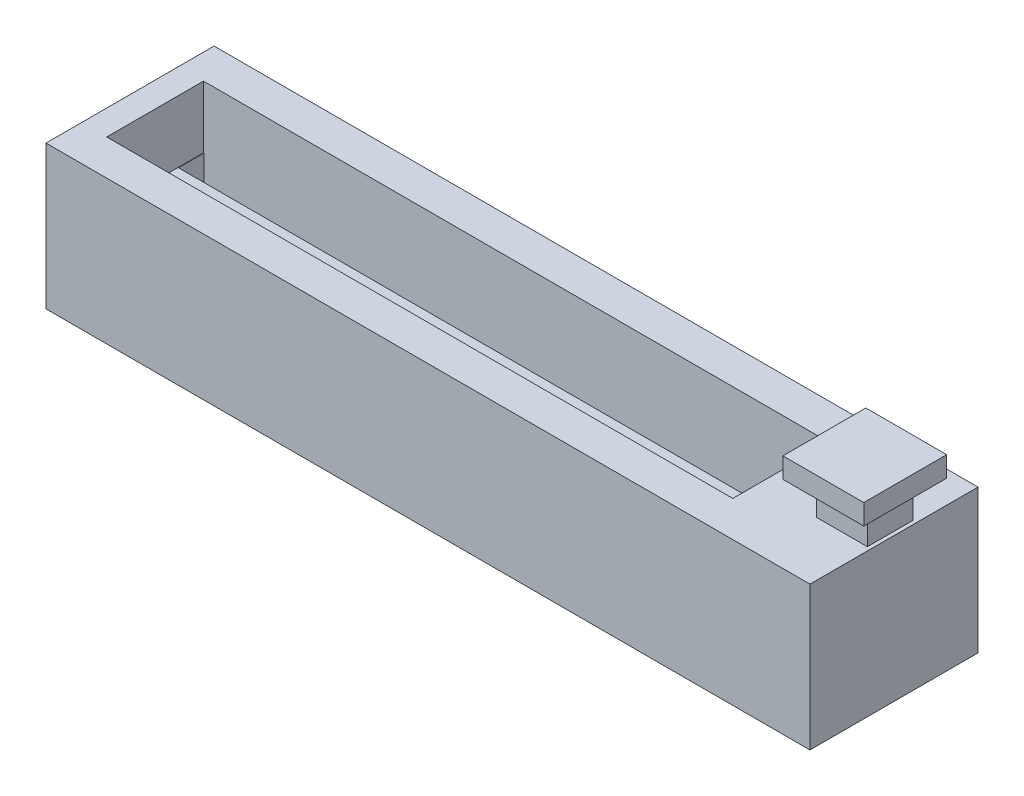
ISO-10303-21;
HEADER;
FILE_DESCRIPTION(('STEP AP214'),'2;1');
FILE_NAME('part.step','',(''),(''),'','','');
FILE_SCHEMA(('AUTOMOTIVE_DESIGN { 1 0 10303 214 1 1 1 1 }'));
ENDSEC;
DATA;
#1=APPLICATION_CONTEXT('core data for automotive mechanical design processes');
#2=APPLICATION_PROTOCOL_DEFINITION('international standard','automotive_design',2000,#1);
#3=PRODUCT_CONTEXT('',#1,'mechanical');
#4=PRODUCT('Part','Part','',(#3));
#5=PRODUCT_RELATED_PRODUCT_CATEGORY('part','',(#4));
#6=PRODUCT_DEFINITION_FORMATION('','',#4);
#7=PRODUCT_DEFINITION_CONTEXT('part definition',#1,'design');
#8=PRODUCT_DEFINITION('design','',#6,#7);
#9=PRODUCT_DEFINITION_SHAPE('','',#8);
#10=(LENGTH_UNIT() NAMED_UNIT(*) SI_UNIT(.MILLI.,.METRE.));
#11=(NAMED_UNIT(*) PLANE_ANGLE_UNIT() SI_UNIT($,.RADIAN.));
#12=(NAMED_UNIT(*) SI_UNIT($,.STERADIAN.) SOLID_ANGLE_UNIT());
#13=UNCERTAINTY_MEASURE_WITH_UNIT(LENGTH_MEASURE(1.E-05),#10,'distance_accuracy_value','');
#14=(GEOMETRIC_REPRESENTATION_CONTEXT(3) GLOBAL_UNCERTAINTY_ASSIGNED_CONTEXT((#13)) GLOBAL_UNIT_ASSIGNED_CONTEXT((#10,
#11,#12)) REPRESENTATION_CONTEXT('',''));
#15=CARTESIAN_POINT('',(0.,0.,0.));
#16=DIRECTION('',(0.,0.,1.));
#17=DIRECTION('',(1.,0.,0.));
#18=AXIS2_PLACEMENT_3D('',#15,#16,#17);
#19=CARTESIAN_POINT('',(0.,13.,3.5));
#20=DIRECTION('',(0.,0.,1.));
#21=DIRECTION('',(1.,0.,0.));
#22=AXIS2_PLACEMENT_3D('',#19,#20,#21);
#23=PLANE('',#22);
#24=DIRECTION('',(0.,-1.,0.));
#25=VECTOR('',#24,1.);
#26=CARTESIAN_POINT('',(0.,13.,3.5));
#27=LINE('',#26,#25);
#28=CARTESIAN_POINT('',(0.,9.03551671751368,3.5));
#29=VERTEX_POINT('',#28);
#30=CARTESIAN_POINT('',(0.,5.,3.5));
#31=VERTEX_POINT('',#30);
#32=EDGE_CURVE('E1055',#29,#31,#27,.T.);
#33=ORIENTED_EDGE('',*,*,#32,.T.);
#34=DIRECTION('',(1.,0.,0.));
#35=VECTOR('',#34,1.);
#36=CARTESIAN_POINT('',(0.,5.,3.5));
#37=LINE('',#36,#35);
#38=CARTESIAN_POINT('',(64.,5.,3.5));
#39=VERTEX_POINT('',#38);
#40=EDGE_CURVE('E1323',#31,#39,#37,.T.);
#41=ORIENTED_EDGE('',*,*,#40,.T.);
#42=DIRECTION('',(0.,1.,0.));
#43=VECTOR('',#42,1.);
#44=CARTESIAN_POINT('',(64.,0.,3.5));
#45=LINE('',#44,#43);
#46=CARTESIAN_POINT('',(64.,13.,3.5));
#47=VERTEX_POINT('',#46);
#48=EDGE_CURVE('E1073',#39,#47,#45,.T.);
#49=ORIENTED_EDGE('',*,*,#48,.T.);
#50=DIRECTION('',(1.,0.,0.));
#51=VECTOR('',#50,1.);
#52=CARTESIAN_POINT('',(0.,13.,3.5));
#53=LINE('',#52,#51);
#54=CARTESIAN_POINT('',(63.9293439173562,13.,3.5));
#55=VERTEX_POINT('',#54);
#56=EDGE_CURVE('E1042',#55,#47,#53,.T.);
#57=ORIENTED_EDGE('',*,*,#56,.F.);
#58=DIRECTION('',(0.,-1.,0.));
#59=VECTOR('',#58,1.);
#60=CARTESIAN_POINT('',(63.9293439173562,19.1,3.5));
#61=LINE('',#60,#59);
#62=CARTESIAN_POINT('',(63.9293439173562,19.1,3.5));
#63=VERTEX_POINT('',#62);
#64=EDGE_CURVE('E1170',#63,#55,#61,.T.);
#65=ORIENTED_EDGE('',*,*,#64,.F.);
#66=DIRECTION('',(1.,0.,0.));
#67=VECTOR('',#66,1.);
#68=CARTESIAN_POINT('',(2.46362599225041,19.1,3.5));
#69=LINE('',#68,#67);
#70=CARTESIAN_POINT('',(2.46362599225041,19.1,3.5));
#71=VERTEX_POINT('',#70);
#72=EDGE_CURVE('E1054',#71,#63,#69,.T.);
#73=ORIENTED_EDGE('',*,*,#72,.F.);
#74=DIRECTION('',(0.,-1.,0.));
#75=VECTOR('',#74,1.);
#76=CARTESIAN_POINT('',(2.46362599225041,19.1,3.5));
#77=LINE('',#76,#75);
#78=CARTESIAN_POINT('',(2.46362599225041,13.,3.5));
#79=VERTEX_POINT('',#78);
#80=EDGE_CURVE('E1152',#71,#79,#77,.T.);
#81=ORIENTED_EDGE('',*,*,#80,.T.);
#82=DIRECTION('',(1.,0.,0.));
#83=VECTOR('',#82,1.);
#84=CARTESIAN_POINT('',(0.,13.,3.5));
#85=LINE('',#84,#83);
#86=CARTESIAN_POINT('',(2.5,13.,3.5));
#87=VERTEX_POINT('',#86);
#88=EDGE_CURVE('E1134',#79,#87,#85,.T.);
#89=ORIENTED_EDGE('',*,*,#88,.T.);
#90=DIRECTION('',(0.,-1.,0.));
#91=VECTOR('',#90,1.);
#92=CARTESIAN_POINT('',(2.5,11.5355167175137,3.5));
#93=LINE('',#92,#91);
#94=CARTESIAN_POINT('',(2.5,9.03551671751368,3.5));
#95=VERTEX_POINT('',#94);
#96=EDGE_CURVE('E1145',#87,#95,#93,.T.);
#97=ORIENTED_EDGE('',*,*,#96,.T.);
#98=DIRECTION('',(1.,0.,0.));
#99=VECTOR('',#98,1.);
#100=CARTESIAN_POINT('',(0.,9.03551671751368,3.5));
#101=LINE('',#100,#99);
#102=EDGE_CURVE('E1299',#29,#95,#101,.T.);
#103=ORIENTED_EDGE('',*,*,#102,.F.);
#104=EDGE_LOOP('',(#33,#41,#49,#57,#65,#73,#81,#89,#97,#103));
#105=FACE_BOUND('',#104,.T.);
#106=ADVANCED_FACE('F704',(#105),#23,.T.);
#107=CARTESIAN_POINT('',(0.,13.,6.));
#108=DIRECTION('',(0.,0.,1.));
#109=DIRECTION('',(1.,0.,0.));
#110=AXIS2_PLACEMENT_3D('',#107,#108,#109);
#111=PLANE('',#110);
#112=DIRECTION('',(1.,0.,0.));
#113=VECTOR('',#112,1.);
#114=CARTESIAN_POINT('',(0.,5.,6.));
#115=LINE('',#114,#113);
#116=CARTESIAN_POINT('',(0.,5.,6.));
#117=VERTEX_POINT('',#116);
#118=CARTESIAN_POINT('',(64.,5.,6.));
#119=VERTEX_POINT('',#118);
#120=EDGE_CURVE('E1292',#117,#119,#115,.T.);
#121=ORIENTED_EDGE('',*,*,#120,.F.);
#122=DIRECTION('',(0.,-1.,0.));
#123=VECTOR('',#122,1.);
#124=CARTESIAN_POINT('',(0.,13.,6.));
#125=LINE('',#124,#123);
#126=CARTESIAN_POINT('',(0.,9.03551671751368,6.));
#127=VERTEX_POINT('',#126);
#128=EDGE_CURVE('E1020',#127,#117,#125,.T.);
#129=ORIENTED_EDGE('',*,*,#128,.F.);
#130=DIRECTION('',(1.,0.,0.));
#131=VECTOR('',#130,1.);
#132=CARTESIAN_POINT('',(0.,9.03551671751368,6.));
#133=LINE('',#132,#131);
#134=CARTESIAN_POINT('',(2.5,9.03551671751368,6.));
#135=VERTEX_POINT('',#134);
#136=EDGE_CURVE('E1139',#127,#135,#133,.T.);
#137=ORIENTED_EDGE('',*,*,#136,.T.);
#138=DIRECTION('',(0.,1.,0.));
#139=VECTOR('',#138,1.);
#140=CARTESIAN_POINT('',(2.5,9.03551671751368,6.));
#141=LINE('',#140,#139);
#142=CARTESIAN_POINT('',(2.5,13.,6.));
#143=VERTEX_POINT('',#142);
#144=EDGE_CURVE('E1137',#135,#143,#141,.T.);
#145=ORIENTED_EDGE('',*,*,#144,.T.);
#146=DIRECTION('',(1.,0.,0.));
#147=VECTOR('',#146,1.);
#148=CARTESIAN_POINT('',(0.,13.,6.));
#149=LINE('',#148,#147);
#150=CARTESIAN_POINT('',(63.9293439173562,13.,6.));
#151=VERTEX_POINT('',#150);
#152=EDGE_CURVE('E1050',#143,#151,#149,.T.);
#153=ORIENTED_EDGE('',*,*,#152,.T.);
#154=DIRECTION('',(1.,0.,0.));
#155=VECTOR('',#154,1.);
#156=CARTESIAN_POINT('',(0.,13.,6.));
#157=LINE('',#156,#155);
#158=CARTESIAN_POINT('',(64.,13.,6.));
#159=VERTEX_POINT('',#158);
#160=EDGE_CURVE('E1030',#151,#159,#157,.T.);
#161=ORIENTED_EDGE('',*,*,#160,.T.);
#162=DIRECTION('',(0.,-1.,0.));
#163=VECTOR('',#162,1.);
#164=CARTESIAN_POINT('',(64.,13.,6.));
#165=LINE('',#164,#163);
#166=EDGE_CURVE('E1214',#159,#119,#165,.T.);
#167=ORIENTED_EDGE('',*,*,#166,.T.);
#168=EDGE_LOOP('',(#121,#129,#137,#145,#153,#161,#167));
#169=FACE_BOUND('',#168,.T.);
#170=ADVANCED_FACE('F1290',(#169),#111,.F.);
#171=CARTESIAN_POINT('',(0.,13.,13.));
#172=DIRECTION('',(0.,0.,1.));
#173=DIRECTION('',(1.,0.,0.));
#174=AXIS2_PLACEMENT_3D('',#171,#172,#173);
#175=PLANE('',#174);
#176=DIRECTION('',(1.,0.,0.));
#177=VECTOR('',#176,1.);
#178=CARTESIAN_POINT('',(0.,5.,13.));
#179=LINE('',#178,#177);
#180=CARTESIAN_POINT('',(0.,5.,13.));
#181=VERTEX_POINT('',#180);
#182=CARTESIAN_POINT('',(64.,5.,13.));
#183=VERTEX_POINT('',#182);
#184=EDGE_CURVE('E1339',#181,#183,#179,.T.);
#185=ORIENTED_EDGE('',*,*,#184,.F.);
#186=DIRECTION('',(0.,-1.,0.));
#187=VECTOR('',#186,1.);
#188=CARTESIAN_POINT('',(0.,13.,13.));
#189=LINE('',#188,#187);
#190=CARTESIAN_POINT('',(0.,9.03551671751368,13.));
#191=VERTEX_POINT('',#190);
#192=EDGE_CURVE('E1068',#191,#181,#189,.T.);
#193=ORIENTED_EDGE('',*,*,#192,.F.);
#194=DIRECTION('',(1.,0.,0.));
#195=VECTOR('',#194,1.);
#196=CARTESIAN_POINT('',(0.,9.03551671751368,13.));
#197=LINE('',#196,#195);
#198=CARTESIAN_POINT('',(2.5,9.03551671751368,13.));
#199=VERTEX_POINT('',#198);
#200=EDGE_CURVE('E1127',#191,#199,#197,.T.);
#201=ORIENTED_EDGE('',*,*,#200,.T.);
#202=DIRECTION('',(0.,1.,0.));
#203=VECTOR('',#202,1.);
#204=CARTESIAN_POINT('',(2.5,11.5355167175137,13.));
#205=LINE('',#204,#203);
#206=CARTESIAN_POINT('',(2.5,13.,13.));
#207=VERTEX_POINT('',#206);
#208=EDGE_CURVE('E1120',#199,#207,#205,.T.);
#209=ORIENTED_EDGE('',*,*,#208,.T.);
#210=DIRECTION('',(1.,0.,0.));
#211=VECTOR('',#210,1.);
#212=CARTESIAN_POINT('',(0.,13.,13.));
#213=LINE('',#212,#211);
#214=CARTESIAN_POINT('',(2.46362599225041,13.,13.));
#215=VERTEX_POINT('',#214);
#216=EDGE_CURVE('E1123',#215,#207,#213,.T.);
#217=ORIENTED_EDGE('',*,*,#216,.F.);
#218=DIRECTION('',(0.,-1.,0.));
#219=VECTOR('',#218,1.);
#220=CARTESIAN_POINT('',(2.46362599225041,19.1,13.));
#221=LINE('',#220,#219);
#222=CARTESIAN_POINT('',(2.46362599225041,19.1,13.));
#223=VERTEX_POINT('',#222);
#224=EDGE_CURVE('E1165',#223,#215,#221,.T.);
#225=ORIENTED_EDGE('',*,*,#224,.F.);
#226=DIRECTION('',(1.,0.,0.));
#227=VECTOR('',#226,1.);
#228=CARTESIAN_POINT('',(2.46362599225041,19.1,13.));
#229=LINE('',#228,#227);
#230=CARTESIAN_POINT('',(63.9293439173562,19.1,13.));
#231=VERTEX_POINT('',#230);
#232=EDGE_CURVE('E1194',#223,#231,#229,.T.);
#233=ORIENTED_EDGE('',*,*,#232,.T.);
#234=DIRECTION('',(0.,-1.,0.));
#235=VECTOR('',#234,1.);
#236=CARTESIAN_POINT('',(63.9293439173562,19.1,13.));
#237=LINE('',#236,#235);
#238=CARTESIAN_POINT('',(63.9293439173562,13.,13.));
#239=VERTEX_POINT('',#238);
#240=EDGE_CURVE('E1184',#231,#239,#237,.T.);
#241=ORIENTED_EDGE('',*,*,#240,.T.);
#242=DIRECTION('',(1.,0.,0.));
#243=VECTOR('',#242,1.);
#244=CARTESIAN_POINT('',(0.,13.,13.));
#245=LINE('',#244,#243);
#246=CARTESIAN_POINT('',(64.,13.,13.));
#247=VERTEX_POINT('',#246);
#248=EDGE_CURVE('E1072',#239,#247,#245,.T.);
#249=ORIENTED_EDGE('',*,*,#248,.T.);
#250=DIRECTION('',(0.,-1.,0.));
#251=VECTOR('',#250,1.);
#252=CARTESIAN_POINT('',(64.,13.,13.));
#253=LINE('',#252,#251);
#254=EDGE_CURVE('E1111',#247,#183,#253,.T.);
#255=ORIENTED_EDGE('',*,*,#254,.T.);
#256=EDGE_LOOP('',(#185,#193,#201,#209,#217,#225,#233,#241,#249,#255));
#257=FACE_BOUND('',#256,.T.);
#258=ADVANCED_FACE('F1224',(#257),#175,.F.);
#259=CARTESIAN_POINT('',(0.,0.,10.5));
#260=DIRECTION('',(0.,0.,-1.));
#261=DIRECTION('',(-1.,0.,0.));
#262=AXIS2_PLACEMENT_3D('',#259,#260,#261);
#263=PLANE('',#262);
#264=DIRECTION('',(-1.,0.,0.));
#265=VECTOR('',#264,1.);
#266=CARTESIAN_POINT('',(0.,5.,10.5));
#267=LINE('',#266,#265);
#268=CARTESIAN_POINT('',(64.,5.,10.5));
#269=VERTEX_POINT('',#268);
#270=CARTESIAN_POINT('',(0.,5.,10.5));
#271=VERTEX_POINT('',#270);
#272=EDGE_CURVE('E1337',#269,#271,#267,.T.);
#273=ORIENTED_EDGE('',*,*,#272,.F.);
#274=DIRECTION('',(0.,1.,0.));
#275=VECTOR('',#274,1.);
#276=CARTESIAN_POINT('',(64.,0.,10.5));
#277=LINE('',#276,#275);
#278=CARTESIAN_POINT('',(64.,13.,10.5));
#279=VERTEX_POINT('',#278);
#280=EDGE_CURVE('E1109',#269,#279,#277,.T.);
#281=ORIENTED_EDGE('',*,*,#280,.T.);
#282=DIRECTION('',(1.,0.,0.));
#283=VECTOR('',#282,1.);
#284=CARTESIAN_POINT('',(0.,13.,10.5));
#285=LINE('',#284,#283);
#286=CARTESIAN_POINT('',(63.9293439173562,13.,10.5));
#287=VERTEX_POINT('',#286);
#288=EDGE_CURVE('E1031',#287,#279,#285,.T.);
#289=ORIENTED_EDGE('',*,*,#288,.F.);
#290=DIRECTION('',(-1.,0.,0.));
#291=VECTOR('',#290,1.);
#292=CARTESIAN_POINT('',(0.,13.,10.5));
#293=LINE('',#292,#291);
#294=CARTESIAN_POINT('',(2.5,13.,10.5));
#295=VERTEX_POINT('',#294);
#296=EDGE_CURVE('E1053',#287,#295,#293,.T.);
#297=ORIENTED_EDGE('',*,*,#296,.T.);
#298=DIRECTION('',(0.,-1.,0.));
#299=VECTOR('',#298,1.);
#300=CARTESIAN_POINT('',(2.5,11.5355167175137,10.5));
#301=LINE('',#300,#299);
#302=CARTESIAN_POINT('',(2.5,9.03551671751368,10.5));
#303=VERTEX_POINT('',#302);
#304=EDGE_CURVE('E1236',#295,#303,#301,.T.);
#305=ORIENTED_EDGE('',*,*,#304,.T.);
#306=DIRECTION('',(1.,0.,0.));
#307=VECTOR('',#306,1.);
#308=CARTESIAN_POINT('',(0.,9.03551671751368,10.5));
#309=LINE('',#308,#307);
#310=CARTESIAN_POINT('',(0.,9.03551671751368,10.5));
#311=VERTEX_POINT('',#310);
#312=EDGE_CURVE('E1246',#311,#303,#309,.T.);
#313=ORIENTED_EDGE('',*,*,#312,.F.);
#314=DIRECTION('',(0.,1.,0.));
#315=VECTOR('',#314,1.);
#316=CARTESIAN_POINT('',(0.,0.,10.5));
#317=LINE('',#316,#315);
#318=EDGE_CURVE('E1026',#271,#311,#317,.T.);
#319=ORIENTED_EDGE('',*,*,#318,.F.);
#320=EDGE_LOOP('',(#273,#281,#289,#297,#305,#313,#319));
#321=FACE_BOUND('',#320,.T.);
#322=ADVANCED_FACE('F1265',(#321),#263,.F.);
#323=CARTESIAN_POINT('',(0.,0.,0.));
#324=DIRECTION('',(-1.,0.,0.));
#325=DIRECTION('',(0.,0.,1.));
#326=AXIS2_PLACEMENT_3D('',#323,#324,#325);
#327=PLANE('',#326);
#328=DIRECTION('',(0.,1.,0.));
#329=VECTOR('',#328,1.);
#330=CARTESIAN_POINT('',(0.,13.,0.));
#331=LINE('',#330,#329);
#332=CARTESIAN_POINT('',(0.,5.,0.));
#333=VERTEX_POINT('',#332);
#334=CARTESIAN_POINT('',(0.,19.1,0.));
#335=VERTEX_POINT('',#334);
#336=EDGE_CURVE('E1096',#333,#335,#331,.T.);
#337=ORIENTED_EDGE('',*,*,#336,.F.);
#338=DIRECTION('',(0.,0.,1.));
#339=VECTOR('',#338,1.);
#340=CARTESIAN_POINT('',(0.,5.,0.));
#341=LINE('',#340,#339);
#342=EDGE_CURVE('E1013',#333,#31,#341,.T.);
#343=ORIENTED_EDGE('',*,*,#342,.T.);
#344=ORIENTED_EDGE('',*,*,#32,.F.);
#345=DIRECTION('',(0.,0.,1.));
#346=VECTOR('',#345,1.);
#347=CARTESIAN_POINT('',(0.,9.03551671751368,3.5));
#348=LINE('',#347,#346);
#349=EDGE_CURVE('E1287',#29,#127,#348,.T.);
#350=ORIENTED_EDGE('',*,*,#349,.T.);
#351=ORIENTED_EDGE('',*,*,#128,.T.);
#352=EDGE_CURVE('E1284',#117,#271,#341,.T.);
#353=ORIENTED_EDGE('',*,*,#352,.T.);
#354=ORIENTED_EDGE('',*,*,#318,.T.);
#355=DIRECTION('',(0.,0.,1.));
#356=VECTOR('',#355,1.);
#357=CARTESIAN_POINT('',(0.,9.03551671751368,10.5));
#358=LINE('',#357,#356);
#359=EDGE_CURVE('E1238',#311,#191,#358,.T.);
#360=ORIENTED_EDGE('',*,*,#359,.T.);
#361=ORIENTED_EDGE('',*,*,#192,.T.);
#362=CARTESIAN_POINT('',(0.,5.,16.5));
#363=VERTEX_POINT('',#362);
#364=EDGE_CURVE('E1008',#181,#363,#341,.T.);
#365=ORIENTED_EDGE('',*,*,#364,.T.);
#366=DIRECTION('',(0.,1.,0.));
#367=VECTOR('',#366,1.);
#368=CARTESIAN_POINT('',(0.,13.,16.5));
#369=LINE('',#368,#367);
#370=CARTESIAN_POINT('',(0.,19.1,16.5));
#371=VERTEX_POINT('',#370);
#372=EDGE_CURVE('E1032',#363,#371,#369,.T.);
#373=ORIENTED_EDGE('',*,*,#372,.T.);
#374=DIRECTION('',(0.,0.,-1.));
#375=VECTOR('',#374,1.);
#376=CARTESIAN_POINT('',(0.,19.1,16.5));
#377=LINE('',#376,#375);
#378=EDGE_CURVE('E1049',#371,#335,#377,.T.);
#379=ORIENTED_EDGE('',*,*,#378,.T.);
#380=EDGE_LOOP('',(#337,#343,#344,#350,#351,#353,#354,#360,#361,#365,#373,#379));
#381=FACE_BOUND('',#380,.T.);
#382=ADVANCED_FACE('F706',(#381),#327,.T.);
#383=CARTESIAN_POINT('',(66.5,13.,16.5));
#384=DIRECTION('',(0.,0.,-1.));
#385=DIRECTION('',(-1.,0.,0.));
#386=AXIS2_PLACEMENT_3D('',#383,#384,#385);
#387=PLANE('',#386);
#388=DIRECTION('',(1.,0.,0.));
#389=VECTOR('',#388,1.);
#390=CARTESIAN_POINT('',(0.,5.,16.5));
#391=LINE('',#390,#389);
#392=CARTESIAN_POINT('',(75.,5.,16.5));
#393=VERTEX_POINT('',#392);
#394=EDGE_CURVE('E994',#363,#393,#391,.T.);
#395=ORIENTED_EDGE('',*,*,#394,.T.);
#396=DIRECTION('',(0.,-1.,0.));
#397=VECTOR('',#396,1.);
#398=CARTESIAN_POINT('',(75.,19.1,16.5));
#399=LINE('',#398,#397);
#400=CARTESIAN_POINT('',(75.,19.1,16.5));
#401=VERTEX_POINT('',#400);
#402=EDGE_CURVE('E722',#401,#393,#399,.T.);
#403=ORIENTED_EDGE('',*,*,#402,.F.);
#404=DIRECTION('',(-1.,0.,0.));
#405=VECTOR('',#404,1.);
#406=CARTESIAN_POINT('',(66.5,19.1,16.5));
#407=LINE('',#406,#405);
#408=EDGE_CURVE('E708',#401,#371,#407,.T.);
#409=ORIENTED_EDGE('',*,*,#408,.T.);
#410=ORIENTED_EDGE('',*,*,#372,.F.);
#411=EDGE_LOOP('',(#395,#403,#409,#410));
#412=FACE_BOUND('',#411,.T.);
#413=ADVANCED_FACE('F1364',(#412),#387,.F.);
#414=CARTESIAN_POINT('',(0.,13.,0.));
#415=DIRECTION('',(0.,0.,1.));
#416=DIRECTION('',(1.,0.,0.));
#417=AXIS2_PLACEMENT_3D('',#414,#415,#416);
#418=PLANE('',#417);
#419=DIRECTION('',(1.,0.,0.));
#420=VECTOR('',#419,1.);
#421=CARTESIAN_POINT('',(0.,19.1,0.));
#422=LINE('',#421,#420);
#423=CARTESIAN_POINT('',(75.,19.1,0.));
#424=VERTEX_POINT('',#423);
#425=EDGE_CURVE('E1090',#335,#424,#422,.T.);
#426=ORIENTED_EDGE('',*,*,#425,.T.);
#427=DIRECTION('',(0.,1.,0.));
#428=VECTOR('',#427,1.);
#429=CARTESIAN_POINT('',(75.,5.,0.));
#430=LINE('',#429,#428);
#431=CARTESIAN_POINT('',(75.,5.,0.));
#432=VERTEX_POINT('',#431);
#433=EDGE_CURVE('E960',#432,#424,#430,.T.);
#434=ORIENTED_EDGE('',*,*,#433,.F.);
#435=DIRECTION('',(-1.,0.,0.));
#436=VECTOR('',#435,1.);
#437=CARTESIAN_POINT('',(86.5,5.,0.));
#438=LINE('',#437,#436);
#439=EDGE_CURVE('E1015',#432,#333,#438,.T.);
#440=ORIENTED_EDGE('',*,*,#439,.T.);
#441=ORIENTED_EDGE('',*,*,#336,.T.);
#442=EDGE_LOOP('',(#426,#434,#440,#441));
#443=FACE_BOUND('',#442,.T.);
#444=ADVANCED_FACE('F1356',(#443),#418,.F.);
#445=CARTESIAN_POINT('',(64.,0.,0.));
#446=DIRECTION('',(1.,0.,0.));
#447=DIRECTION('',(0.,0.,-1.));
#448=AXIS2_PLACEMENT_3D('',#445,#446,#447);
#449=PLANE('',#448);
#450=DIRECTION('',(0.,0.,-1.));
#451=VECTOR('',#450,1.);
#452=CARTESIAN_POINT('',(64.,5.,0.));
#453=LINE('',#452,#451);
#454=EDGE_CURVE('E1335',#183,#269,#453,.T.);
#455=ORIENTED_EDGE('',*,*,#454,.F.);
#456=ORIENTED_EDGE('',*,*,#254,.F.);
#457=DIRECTION('',(0.,0.,1.));
#458=VECTOR('',#457,1.);
#459=CARTESIAN_POINT('',(64.,13.,10.5));
#460=LINE('',#459,#458);
#461=EDGE_CURVE('E1112',#279,#247,#460,.T.);
#462=ORIENTED_EDGE('',*,*,#461,.F.);
#463=ORIENTED_EDGE('',*,*,#280,.F.);
#464=EDGE_LOOP('',(#455,#456,#462,#463));
#465=FACE_BOUND('',#464,.T.);
#466=ADVANCED_FACE('F1354',(#465),#449,.F.);
#467=CARTESIAN_POINT('',(64.,0.,0.));
#468=DIRECTION('',(1.,0.,0.));
#469=DIRECTION('',(0.,0.,-1.));
#470=AXIS2_PLACEMENT_3D('',#467,#468,#469);
#471=PLANE('',#470);
#472=DIRECTION('',(0.,0.,-1.));
#473=VECTOR('',#472,1.);
#474=CARTESIAN_POINT('',(64.,5.,0.));
#475=LINE('',#474,#473);
#476=EDGE_CURVE('E1017',#119,#39,#475,.T.);
#477=ORIENTED_EDGE('',*,*,#476,.F.);
#478=ORIENTED_EDGE('',*,*,#166,.F.);
#479=DIRECTION('',(0.,0.,1.));
#480=VECTOR('',#479,1.);
#481=CARTESIAN_POINT('',(64.,13.,3.5));
#482=LINE('',#481,#480);
#483=EDGE_CURVE('E1212',#47,#159,#482,.T.);
#484=ORIENTED_EDGE('',*,*,#483,.F.);
#485=ORIENTED_EDGE('',*,*,#48,.F.);
#486=EDGE_LOOP('',(#477,#478,#484,#485));
#487=FACE_BOUND('',#486,.T.);
#488=ADVANCED_FACE('F1351',(#487),#471,.F.);
#489=CARTESIAN_POINT('',(0.,13.,0.));
#490=DIRECTION('',(0.,-1.,0.));
#491=DIRECTION('',(0.,0.,-1.));
#492=AXIS2_PLACEMENT_3D('',#489,#490,#491);
#493=PLANE('',#492);
#494=ORIENTED_EDGE('',*,*,#56,.T.);
#495=ORIENTED_EDGE('',*,*,#483,.T.);
#496=ORIENTED_EDGE('',*,*,#160,.F.);
#497=DIRECTION('',(0.,0.,1.));
#498=VECTOR('',#497,1.);
#499=CARTESIAN_POINT('',(63.9293439173562,13.,3.5));
#500=LINE('',#499,#498);
#501=EDGE_CURVE('E1174',#55,#151,#500,.T.);
#502=ORIENTED_EDGE('',*,*,#501,.F.);
#503=EDGE_LOOP('',(#494,#495,#496,#502));
#504=FACE_BOUND('',#503,.T.);
#505=ADVANCED_FACE('F1275',(#504),#493,.T.);
#506=ORIENTED_EDGE('',*,*,#288,.T.);
#507=ORIENTED_EDGE('',*,*,#461,.T.);
#508=ORIENTED_EDGE('',*,*,#248,.F.);
#509=EDGE_CURVE('E1061',#287,#239,#500,.T.);
#510=ORIENTED_EDGE('',*,*,#509,.F.);
#511=EDGE_LOOP('',(#506,#507,#508,#510));
#512=FACE_BOUND('',#511,.T.);
#513=ADVANCED_FACE('F1208',(#512),#493,.T.);
#514=CARTESIAN_POINT('',(0.,19.1,0.));
#515=DIRECTION('',(0.,-1.,0.));
#516=DIRECTION('',(0.,0.,-1.));
#517=AXIS2_PLACEMENT_3D('',#514,#515,#516);
#518=PLANE('',#517);
#519=DIRECTION('',(1.,0.,0.));
#520=VECTOR('',#519,1.);
#521=CARTESIAN_POINT('',(0.,19.1,6.));
#522=LINE('',#521,#520);
#523=CARTESIAN_POINT('',(69.6376415278989,19.1,6.));
#524=VERTEX_POINT('',#523);
#525=CARTESIAN_POINT('',(74.6376415278988,19.1,6.));
#526=VERTEX_POINT('',#525);
#527=EDGE_CURVE('E12',#524,#526,#522,.T.);
#528=ORIENTED_EDGE('',*,*,#527,.T.);
#529=DIRECTION('',(0.,0.,-1.));
#530=VECTOR('',#529,1.);
#531=CARTESIAN_POINT('',(74.6376415278988,19.1,10.5));
#532=LINE('',#531,#530);
#533=CARTESIAN_POINT('',(74.6376415278988,19.1,10.5));
#534=VERTEX_POINT('',#533);
#535=EDGE_CURVE('E972',#534,#526,#532,.T.);
#536=ORIENTED_EDGE('',*,*,#535,.F.);
#537=DIRECTION('',(-1.,0.,0.));
#538=VECTOR('',#537,1.);
#539=CARTESIAN_POINT('',(0.,19.1,10.5));
#540=LINE('',#539,#538);
#541=CARTESIAN_POINT('',(69.6376415278988,19.1,10.5));
#542=VERTEX_POINT('',#541);
#543=EDGE_CURVE('E714',#534,#542,#540,.T.);
#544=ORIENTED_EDGE('',*,*,#543,.T.);
#545=DIRECTION('',(0.,0.,1.));
#546=VECTOR('',#545,1.);
#547=CARTESIAN_POINT('',(69.6376415278988,19.1,6.));
#548=LINE('',#547,#546);
#549=EDGE_CURVE('E995',#524,#542,#548,.T.);
#550=ORIENTED_EDGE('',*,*,#549,.F.);
#551=EDGE_LOOP('',(#528,#536,#544,#550));
#552=FACE_BOUND('',#551,.T.);
#553=ORIENTED_EDGE('',*,*,#408,.F.);
#554=DIRECTION('',(0.,0.,1.));
#555=VECTOR('',#554,1.);
#556=CARTESIAN_POINT('',(75.,19.1,0.));
#557=LINE('',#556,#555);
#558=EDGE_CURVE('E962',#424,#401,#557,.T.);
#559=ORIENTED_EDGE('',*,*,#558,.F.);
#560=ORIENTED_EDGE('',*,*,#425,.F.);
#561=ORIENTED_EDGE('',*,*,#378,.F.);
#562=EDGE_LOOP('',(#553,#559,#560,#561));
#563=FACE_BOUND('',#562,.T.);
#564=DIRECTION('',(0.,0.,1.));
#565=VECTOR('',#564,1.);
#566=CARTESIAN_POINT('',(2.46362599225041,19.1,3.5));
#567=LINE('',#566,#565);
#568=EDGE_CURVE('E1155',#71,#223,#567,.T.);
#569=ORIENTED_EDGE('',*,*,#568,.F.);
#570=ORIENTED_EDGE('',*,*,#72,.T.);
#571=DIRECTION('',(0.,0.,1.));
#572=VECTOR('',#571,1.);
#573=CARTESIAN_POINT('',(63.9293439173562,19.1,3.5));
#574=LINE('',#573,#572);
#575=EDGE_CURVE('E1160',#63,#231,#574,.T.);
#576=ORIENTED_EDGE('',*,*,#575,.T.);
#577=ORIENTED_EDGE('',*,*,#232,.F.);
#578=EDGE_LOOP('',(#569,#570,#576,#577));
#579=FACE_BOUND('',#578,.T.);
#580=ADVANCED_FACE('F1320',(#552,#563,#579),#518,.F.);
#581=CARTESIAN_POINT('',(0.,13.,0.));
#582=DIRECTION('',(0.,-1.,0.));
#583=DIRECTION('',(0.,0.,-1.));
#584=AXIS2_PLACEMENT_3D('',#581,#582,#583);
#585=PLANE('',#584);
#586=EDGE_CURVE('E1181',#151,#287,#500,.T.);
#587=ORIENTED_EDGE('',*,*,#586,.F.);
#588=ORIENTED_EDGE('',*,*,#152,.F.);
#589=DIRECTION('',(0.,0.,-1.));
#590=VECTOR('',#589,1.);
#591=CARTESIAN_POINT('',(2.5,13.,6.));
#592=LINE('',#591,#590);
#593=EDGE_CURVE('E1130',#143,#87,#592,.T.);
#594=ORIENTED_EDGE('',*,*,#593,.T.);
#595=ORIENTED_EDGE('',*,*,#88,.F.);
#596=DIRECTION('',(0.,0.,1.));
#597=VECTOR('',#596,1.);
#598=CARTESIAN_POINT('',(2.46362599225041,13.,3.5));
#599=LINE('',#598,#597);
#600=EDGE_CURVE('E1133',#79,#215,#599,.T.);
#601=ORIENTED_EDGE('',*,*,#600,.T.);
#602=ORIENTED_EDGE('',*,*,#216,.T.);
#603=DIRECTION('',(0.,0.,-1.));
#604=VECTOR('',#603,1.);
#605=CARTESIAN_POINT('',(2.5,13.,13.));
#606=LINE('',#605,#604);
#607=EDGE_CURVE('E1140',#207,#295,#606,.T.);
#608=ORIENTED_EDGE('',*,*,#607,.T.);
#609=ORIENTED_EDGE('',*,*,#296,.F.);
#610=EDGE_LOOP('',(#587,#588,#594,#595,#601,#602,#608,#609));
#611=FACE_BOUND('',#610,.T.);
#612=ADVANCED_FACE('F1232',(#611),#585,.F.);
#613=CARTESIAN_POINT('',(2.46362599225041,19.1,3.5));
#614=DIRECTION('',(1.,0.,0.));
#615=DIRECTION('',(0.,0.,-1.));
#616=AXIS2_PLACEMENT_3D('',#613,#614,#615);
#617=PLANE('',#616);
#618=ORIENTED_EDGE('',*,*,#600,.F.);
#619=ORIENTED_EDGE('',*,*,#80,.F.);
#620=ORIENTED_EDGE('',*,*,#568,.T.);
#621=ORIENTED_EDGE('',*,*,#224,.T.);
#622=EDGE_LOOP('',(#618,#619,#620,#621));
#623=FACE_BOUND('',#622,.T.);
#624=ADVANCED_FACE('F1318',(#623),#617,.T.);
#625=CARTESIAN_POINT('',(63.9293439173562,19.1,3.5));
#626=DIRECTION('',(1.,0.,0.));
#627=DIRECTION('',(0.,0.,-1.));
#628=AXIS2_PLACEMENT_3D('',#625,#626,#627);
#629=PLANE('',#628);
#630=ORIENTED_EDGE('',*,*,#501,.T.);
#631=ORIENTED_EDGE('',*,*,#586,.T.);
#632=ORIENTED_EDGE('',*,*,#509,.T.);
#633=ORIENTED_EDGE('',*,*,#240,.F.);
#634=ORIENTED_EDGE('',*,*,#575,.F.);
#635=ORIENTED_EDGE('',*,*,#64,.T.);
#636=EDGE_LOOP('',(#630,#631,#632,#633,#634,#635));
#637=FACE_BOUND('',#636,.T.);
#638=ADVANCED_FACE('F1203',(#637),#629,.F.);
#639=CARTESIAN_POINT('',(2.5,0.,0.));
#640=DIRECTION('',(1.,0.,0.));
#641=DIRECTION('',(0.,0.,-1.));
#642=AXIS2_PLACEMENT_3D('',#639,#640,#641);
#643=PLANE('',#642);
#644=ORIENTED_EDGE('',*,*,#144,.F.);
#645=DIRECTION('',(0.,0.,1.));
#646=VECTOR('',#645,1.);
#647=CARTESIAN_POINT('',(2.5,9.03551671751368,3.5));
#648=LINE('',#647,#646);
#649=EDGE_CURVE('E1297',#95,#135,#648,.T.);
#650=ORIENTED_EDGE('',*,*,#649,.F.);
#651=ORIENTED_EDGE('',*,*,#96,.F.);
#652=ORIENTED_EDGE('',*,*,#593,.F.);
#653=EDGE_LOOP('',(#644,#650,#651,#652));
#654=FACE_BOUND('',#653,.T.);
#655=ADVANCED_FACE('F1314',(#654),#643,.T.);
#656=CARTESIAN_POINT('',(0.,9.03551671751368,3.5));
#657=DIRECTION('',(0.,1.,0.));
#658=DIRECTION('',(0.,0.,1.));
#659=AXIS2_PLACEMENT_3D('',#656,#657,#658);
#660=PLANE('',#659);
#661=ORIENTED_EDGE('',*,*,#649,.T.);
#662=ORIENTED_EDGE('',*,*,#136,.F.);
#663=ORIENTED_EDGE('',*,*,#349,.F.);
#664=ORIENTED_EDGE('',*,*,#102,.T.);
#665=EDGE_LOOP('',(#661,#662,#663,#664));
#666=FACE_BOUND('',#665,.T.);
#667=ADVANCED_FACE('F1294',(#666),#660,.F.);
#668=CARTESIAN_POINT('',(2.5,0.,0.));
#669=DIRECTION('',(1.,0.,0.));
#670=DIRECTION('',(0.,0.,-1.));
#671=AXIS2_PLACEMENT_3D('',#668,#669,#670);
#672=PLANE('',#671);
#673=ORIENTED_EDGE('',*,*,#607,.F.);
#674=ORIENTED_EDGE('',*,*,#208,.F.);
#675=DIRECTION('',(0.,0.,1.));
#676=VECTOR('',#675,1.);
#677=CARTESIAN_POINT('',(2.5,9.03551671751368,10.5));
#678=LINE('',#677,#676);
#679=EDGE_CURVE('E1249',#303,#199,#678,.T.);
#680=ORIENTED_EDGE('',*,*,#679,.F.);
#681=ORIENTED_EDGE('',*,*,#304,.F.);
#682=EDGE_LOOP('',(#673,#674,#680,#681));
#683=FACE_BOUND('',#682,.T.);
#684=ADVANCED_FACE('F1235',(#683),#672,.T.);
#685=CARTESIAN_POINT('',(0.,9.03551671751368,10.5));
#686=DIRECTION('',(0.,1.,0.));
#687=DIRECTION('',(0.,0.,1.));
#688=AXIS2_PLACEMENT_3D('',#685,#686,#687);
#689=PLANE('',#688);
#690=ORIENTED_EDGE('',*,*,#679,.T.);
#691=ORIENTED_EDGE('',*,*,#200,.F.);
#692=ORIENTED_EDGE('',*,*,#359,.F.);
#693=ORIENTED_EDGE('',*,*,#312,.T.);
#694=EDGE_LOOP('',(#690,#691,#692,#693));
#695=FACE_BOUND('',#694,.T.);
#696=ADVANCED_FACE('F1259',(#695),#689,.F.);
#697=CARTESIAN_POINT('',(79.6376415278988,13.,6.));
#698=DIRECTION('',(0.,0.,-1.));
#699=DIRECTION('',(-1.,0.,0.));
#700=AXIS2_PLACEMENT_3D('',#697,#698,#699);
#701=PLANE('',#700);
#702=DIRECTION('',(0.,1.,0.));
#703=VECTOR('',#702,1.);
#704=CARTESIAN_POINT('',(74.6376415278988,19.1,6.));
#705=LINE('',#704,#703);
#706=CARTESIAN_POINT('',(74.6376415278988,22.5,6.));
#707=VERTEX_POINT('',#706);
#708=EDGE_CURVE('E730',#526,#707,#705,.T.);
#709=ORIENTED_EDGE('',*,*,#708,.F.);
#710=ORIENTED_EDGE('',*,*,#527,.F.);
#711=DIRECTION('',(0.,-1.,0.));
#712=VECTOR('',#711,1.);
#713=CARTESIAN_POINT('',(69.6376415278988,22.5,6.));
#714=LINE('',#713,#712);
#715=CARTESIAN_POINT('',(69.6376415278988,22.5,6.));
#716=VERTEX_POINT('',#715);
#717=EDGE_CURVE('E991',#716,#524,#714,.T.);
#718=ORIENTED_EDGE('',*,*,#717,.F.);
#719=DIRECTION('',(-1.,0.,0.));
#720=VECTOR('',#719,1.);
#721=CARTESIAN_POINT('',(79.6376415278988,22.5,6.));
#722=LINE('',#721,#720);
#723=EDGE_CURVE('E1021',#707,#716,#722,.T.);
#724=ORIENTED_EDGE('',*,*,#723,.F.);
#725=EDGE_LOOP('',(#709,#710,#718,#724));
#726=FACE_BOUND('',#725,.T.);
#727=ADVANCED_FACE('F1515',(#726),#701,.T.);
#728=CARTESIAN_POINT('',(76.1288912670421,13.,10.5));
#729=DIRECTION('',(0.,0.,1.));
#730=DIRECTION('',(1.,0.,0.));
#731=AXIS2_PLACEMENT_3D('',#728,#729,#730);
#732=PLANE('',#731);
#733=DIRECTION('',(0.,-1.,0.));
#734=VECTOR('',#733,1.);
#735=CARTESIAN_POINT('',(74.6376415278988,22.5,10.5));
#736=LINE('',#735,#734);
#737=CARTESIAN_POINT('',(74.6376415278988,22.5,10.5));
#738=VERTEX_POINT('',#737);
#739=EDGE_CURVE('E978',#738,#534,#736,.T.);
#740=ORIENTED_EDGE('',*,*,#739,.F.);
#741=DIRECTION('',(1.,0.,0.));
#742=VECTOR('',#741,1.);
#743=CARTESIAN_POINT('',(76.1288912670421,22.5,10.5));
#744=LINE('',#743,#742);
#745=CARTESIAN_POINT('',(69.6376415278988,22.5,10.5));
#746=VERTEX_POINT('',#745);
#747=EDGE_CURVE('E1341',#746,#738,#744,.T.);
#748=ORIENTED_EDGE('',*,*,#747,.F.);
#749=DIRECTION('',(0.,-1.,0.));
#750=VECTOR('',#749,1.);
#751=CARTESIAN_POINT('',(69.6376415278988,22.5,10.5));
#752=LINE('',#751,#750);
#753=EDGE_CURVE('E988',#746,#542,#752,.T.);
#754=ORIENTED_EDGE('',*,*,#753,.T.);
#755=ORIENTED_EDGE('',*,*,#543,.F.);
#756=EDGE_LOOP('',(#740,#748,#754,#755));
#757=FACE_BOUND('',#756,.T.);
#758=ADVANCED_FACE('F1425',(#757),#732,.T.);
#759=CARTESIAN_POINT('',(0.,5.,0.));
#760=DIRECTION('',(0.,-1.,0.));
#761=DIRECTION('',(0.,0.,-1.));
#762=AXIS2_PLACEMENT_3D('',#759,#760,#761);
#763=PLANE('',#762);
#764=DIRECTION('',(0.,0.,-1.));
#765=VECTOR('',#764,1.);
#766=CARTESIAN_POINT('',(75.,5.,16.5));
#767=LINE('',#766,#765);
#768=EDGE_CURVE('E910',#393,#432,#767,.T.);
#769=ORIENTED_EDGE('',*,*,#768,.F.);
#770=ORIENTED_EDGE('',*,*,#394,.F.);
#771=ORIENTED_EDGE('',*,*,#364,.F.);
#772=ORIENTED_EDGE('',*,*,#184,.T.);
#773=ORIENTED_EDGE('',*,*,#454,.T.);
#774=ORIENTED_EDGE('',*,*,#272,.T.);
#775=ORIENTED_EDGE('',*,*,#352,.F.);
#776=ORIENTED_EDGE('',*,*,#120,.T.);
#777=ORIENTED_EDGE('',*,*,#476,.T.);
#778=ORIENTED_EDGE('',*,*,#40,.F.);
#779=ORIENTED_EDGE('',*,*,#342,.F.);
#780=ORIENTED_EDGE('',*,*,#439,.F.);
#781=EDGE_LOOP('',(#769,#770,#771,#772,#773,#774,#775,#776,#777,#778,#779,#780));
#782=FACE_BOUND('',#781,.T.);
#783=ADVANCED_FACE('F1352',(#782),#763,.T.);
#784=CARTESIAN_POINT('',(69.637641527899,0.,0.));
#785=DIRECTION('',(-1.,0.,0.));
#786=DIRECTION('',(0.,0.,1.));
#787=AXIS2_PLACEMENT_3D('',#784,#785,#786);
#788=PLANE('',#787);
#789=DIRECTION('',(0.,0.,-1.));
#790=VECTOR('',#789,1.);
#791=CARTESIAN_POINT('',(69.6376415278988,22.5,10.5));
#792=LINE('',#791,#790);
#793=EDGE_CURVE('E977',#746,#716,#792,.T.);
#794=ORIENTED_EDGE('',*,*,#793,.T.);
#795=ORIENTED_EDGE('',*,*,#717,.T.);
#796=ORIENTED_EDGE('',*,*,#549,.T.);
#797=ORIENTED_EDGE('',*,*,#753,.F.);
#798=EDGE_LOOP('',(#794,#795,#796,#797));
#799=FACE_BOUND('',#798,.T.);
#800=ADVANCED_FACE('F1424',(#799),#788,.T.);
#801=CARTESIAN_POINT('',(74.637641527899,0.,0.));
#802=DIRECTION('',(-1.,0.,0.));
#803=DIRECTION('',(0.,0.,1.));
#804=AXIS2_PLACEMENT_3D('',#801,#802,#803);
#805=PLANE('',#804);
#806=DIRECTION('',(0.,0.,1.));
#807=VECTOR('',#806,1.);
#808=CARTESIAN_POINT('',(74.6376415278988,22.5,6.));
#809=LINE('',#808,#807);
#810=EDGE_CURVE('E975',#707,#738,#809,.T.);
#811=ORIENTED_EDGE('',*,*,#810,.T.);
#812=ORIENTED_EDGE('',*,*,#739,.T.);
#813=ORIENTED_EDGE('',*,*,#535,.T.);
#814=ORIENTED_EDGE('',*,*,#708,.T.);
#815=EDGE_LOOP('',(#811,#812,#813,#814));
#816=FACE_BOUND('',#815,.T.);
#817=ADVANCED_FACE('F1434',(#816),#805,.F.);
#818=CARTESIAN_POINT('',(75.,0.,0.));
#819=DIRECTION('',(-1.,0.,0.));
#820=DIRECTION('',(0.,0.,1.));
#821=AXIS2_PLACEMENT_3D('',#818,#819,#820);
#822=PLANE('',#821);
#823=ORIENTED_EDGE('',*,*,#433,.T.);
#824=ORIENTED_EDGE('',*,*,#558,.T.);
#825=ORIENTED_EDGE('',*,*,#402,.T.);
#826=ORIENTED_EDGE('',*,*,#768,.T.);
#827=EDGE_LOOP('',(#823,#824,#825,#826));
#828=FACE_BOUND('',#827,.T.);
#829=ADVANCED_FACE('F1445',(#828),#822,.F.);
#830=CARTESIAN_POINT('',(0.,24.5,0.));
#831=DIRECTION('',(0.,1.,0.));
#832=DIRECTION('',(0.,0.,1.));
#833=AXIS2_PLACEMENT_3D('',#830,#831,#832);
#834=PLANE('',#833);
#835=DIRECTION('',(0.,0.,-1.));
#836=VECTOR('',#835,1.);
#837=CARTESIAN_POINT('',(68.1686627316848,24.5,12.3202178003502));
#838=LINE('',#837,#836);
#839=CARTESIAN_POINT('',(68.1686627316848,24.5,12.3202178003502));
#840=VERTEX_POINT('',#839);
#841=CARTESIAN_POINT('',(68.1686627316848,24.5,4.17978219964982));
#842=VERTEX_POINT('',#841);
#843=EDGE_CURVE('E935',#840,#842,#838,.T.);
#844=ORIENTED_EDGE('',*,*,#843,.F.);
#845=DIRECTION('',(1.,0.,0.));
#846=VECTOR('',#845,1.);
#847=CARTESIAN_POINT('',(68.1686627316848,24.5,12.3202178003502));
#848=LINE('',#847,#846);
#849=CARTESIAN_POINT('',(76.1066203241128,24.5,12.3202178003502));
#850=VERTEX_POINT('',#849);
#851=EDGE_CURVE('E911',#840,#850,#848,.T.);
#852=ORIENTED_EDGE('',*,*,#851,.T.);
#853=DIRECTION('',(0.,0.,-1.));
#854=VECTOR('',#853,1.);
#855=CARTESIAN_POINT('',(76.1066203241128,24.5,12.3202178003502));
#856=LINE('',#855,#854);
#857=CARTESIAN_POINT('',(76.1066203241128,24.5,4.17978219964982));
#858=VERTEX_POINT('',#857);
#859=EDGE_CURVE('E923',#850,#858,#856,.T.);
#860=ORIENTED_EDGE('',*,*,#859,.T.);
#861=DIRECTION('',(1.,0.,0.));
#862=VECTOR('',#861,1.);
#863=CARTESIAN_POINT('',(68.1686627316848,24.5,4.17978219964982));
#864=LINE('',#863,#862);
#865=EDGE_CURVE('E945',#842,#858,#864,.T.);
#866=ORIENTED_EDGE('',*,*,#865,.F.);
#867=EDGE_LOOP('',(#844,#852,#860,#866));
#868=FACE_BOUND('',#867,.T.);
#869=ADVANCED_FACE('F1453',(#868),#834,.T.);
#870=CARTESIAN_POINT('',(0.,22.5,0.));
#871=DIRECTION('',(0.,1.,0.));
#872=DIRECTION('',(0.,0.,1.));
#873=AXIS2_PLACEMENT_3D('',#870,#871,#872);
#874=PLANE('',#873);
#875=ORIENTED_EDGE('',*,*,#810,.F.);
#876=ORIENTED_EDGE('',*,*,#723,.T.);
#877=ORIENTED_EDGE('',*,*,#793,.F.);
#878=ORIENTED_EDGE('',*,*,#747,.T.);
#879=EDGE_LOOP('',(#875,#876,#877,#878));
#880=FACE_BOUND('',#879,.T.);
#881=DIRECTION('',(0.,0.,-1.));
#882=VECTOR('',#881,1.);
#883=CARTESIAN_POINT('',(68.1686627316848,22.5,12.3202178003502));
#884=LINE('',#883,#882);
#885=CARTESIAN_POINT('',(68.1686627316848,22.5,12.3202178003502));
#886=VERTEX_POINT('',#885);
#887=CARTESIAN_POINT('',(68.1686627316848,22.5,4.17978219964982));
#888=VERTEX_POINT('',#887);
#889=EDGE_CURVE('E954',#886,#888,#884,.T.);
#890=ORIENTED_EDGE('',*,*,#889,.T.);
#891=DIRECTION('',(1.,0.,0.));
#892=VECTOR('',#891,1.);
#893=CARTESIAN_POINT('',(68.1686627316848,22.5,4.17978219964982));
#894=LINE('',#893,#892);
#895=CARTESIAN_POINT('',(76.1066203241128,22.5,4.17978219964982));
#896=VERTEX_POINT('',#895);
#897=EDGE_CURVE('E916',#888,#896,#894,.T.);
#898=ORIENTED_EDGE('',*,*,#897,.T.);
#899=DIRECTION('',(0.,0.,-1.));
#900=VECTOR('',#899,1.);
#901=CARTESIAN_POINT('',(76.1066203241128,22.5,12.3202178003502));
#902=LINE('',#901,#900);
#903=CARTESIAN_POINT('',(76.1066203241128,22.5,12.3202178003502));
#904=VERTEX_POINT('',#903);
#905=EDGE_CURVE('E914',#904,#896,#902,.T.);
#906=ORIENTED_EDGE('',*,*,#905,.F.);
#907=DIRECTION('',(1.,0.,0.));
#908=VECTOR('',#907,1.);
#909=CARTESIAN_POINT('',(68.1686627316848,22.5,12.3202178003502));
#910=LINE('',#909,#908);
#911=EDGE_CURVE('E900',#886,#904,#910,.T.);
#912=ORIENTED_EDGE('',*,*,#911,.F.);
#913=EDGE_LOOP('',(#890,#898,#906,#912));
#914=FACE_BOUND('',#913,.T.);
#915=ADVANCED_FACE('F915',(#880,#914),#874,.F.);
#916=CARTESIAN_POINT('',(68.1686627316848,22.5,12.3202178003502));
#917=DIRECTION('',(1.,0.,0.));
#918=DIRECTION('',(0.,0.,-1.));
#919=AXIS2_PLACEMENT_3D('',#916,#917,#918);
#920=PLANE('',#919);
#921=ORIENTED_EDGE('',*,*,#843,.T.);
#922=DIRECTION('',(0.,1.,0.));
#923=VECTOR('',#922,1.);
#924=CARTESIAN_POINT('',(68.1686627316848,22.5,4.17978219964982));
#925=LINE('',#924,#923);
#926=EDGE_CURVE('E949',#888,#842,#925,.T.);
#927=ORIENTED_EDGE('',*,*,#926,.F.);
#928=ORIENTED_EDGE('',*,*,#889,.F.);
#929=DIRECTION('',(0.,1.,0.));
#930=VECTOR('',#929,1.);
#931=CARTESIAN_POINT('',(68.1686627316848,22.5,12.3202178003502));
#932=LINE('',#931,#930);
#933=EDGE_CURVE('E907',#886,#840,#932,.T.);
#934=ORIENTED_EDGE('',*,*,#933,.T.);
#935=EDGE_LOOP('',(#921,#927,#928,#934));
#936=FACE_BOUND('',#935,.T.);
#937=ADVANCED_FACE('F1469',(#936),#920,.F.);
#938=CARTESIAN_POINT('',(68.1686627316848,22.5,4.17978219964982));
#939=DIRECTION('',(0.,0.,1.));
#940=DIRECTION('',(1.,0.,0.));
#941=AXIS2_PLACEMENT_3D('',#938,#939,#940);
#942=PLANE('',#941);
#943=ORIENTED_EDGE('',*,*,#865,.T.);
#944=DIRECTION('',(0.,1.,0.));
#945=VECTOR('',#944,1.);
#946=CARTESIAN_POINT('',(76.1066203241128,22.5,4.17978219964982));
#947=LINE('',#946,#945);
#948=EDGE_CURVE('E925',#896,#858,#947,.T.);
#949=ORIENTED_EDGE('',*,*,#948,.F.);
#950=ORIENTED_EDGE('',*,*,#897,.F.);
#951=ORIENTED_EDGE('',*,*,#926,.T.);
#952=EDGE_LOOP('',(#943,#949,#950,#951));
#953=FACE_BOUND('',#952,.T.);
#954=ADVANCED_FACE('F1478',(#953),#942,.F.);
#955=CARTESIAN_POINT('',(68.1686627316848,22.5,12.3202178003502));
#956=DIRECTION('',(0.,0.,1.));
#957=DIRECTION('',(1.,0.,0.));
#958=AXIS2_PLACEMENT_3D('',#955,#956,#957);
#959=PLANE('',#958);
#960=ORIENTED_EDGE('',*,*,#851,.F.);
#961=ORIENTED_EDGE('',*,*,#933,.F.);
#962=ORIENTED_EDGE('',*,*,#911,.T.);
#963=DIRECTION('',(0.,1.,0.));
#964=VECTOR('',#963,1.);
#965=CARTESIAN_POINT('',(76.1066203241128,22.5,12.3202178003502));
#966=LINE('',#965,#964);
#967=EDGE_CURVE('E904',#904,#850,#966,.T.);
#968=ORIENTED_EDGE('',*,*,#967,.T.);
#969=EDGE_LOOP('',(#960,#961,#962,#968));
#970=FACE_BOUND('',#969,.T.);
#971=ADVANCED_FACE('F902',(#970),#959,.T.);
#972=CARTESIAN_POINT('',(76.1066203241128,22.5,12.3202178003502));
#973=DIRECTION('',(1.,0.,0.));
#974=DIRECTION('',(0.,0.,-1.));
#975=AXIS2_PLACEMENT_3D('',#972,#973,#974);
#976=PLANE('',#975);
#977=ORIENTED_EDGE('',*,*,#859,.F.);
#978=ORIENTED_EDGE('',*,*,#967,.F.);
#979=ORIENTED_EDGE('',*,*,#905,.T.);
#980=ORIENTED_EDGE('',*,*,#948,.T.);
#981=EDGE_LOOP('',(#977,#978,#979,#980));
#982=FACE_BOUND('',#981,.T.);
#983=ADVANCED_FACE('F921',(#982),#976,.T.);
#984=CLOSED_SHELL('',(#106,#170,#258,#322,#382,#413,#444,#466,#488,#505,#513,#580,#612,#624,
#638,#655,#667,#684,#696,#727,#758,#783,#800,#817,#829,#869,#915,#937,#954,#971,#983));
#985=MANIFOLD_SOLID_BREP('B2',#984);
#986=ADVANCED_BREP_SHAPE_REPRESENTATION('',(#18,#985),#14);
#987=SHAPE_DEFINITION_REPRESENTATION(#9,#986);
ENDSEC;
END-ISO-10303-21;
